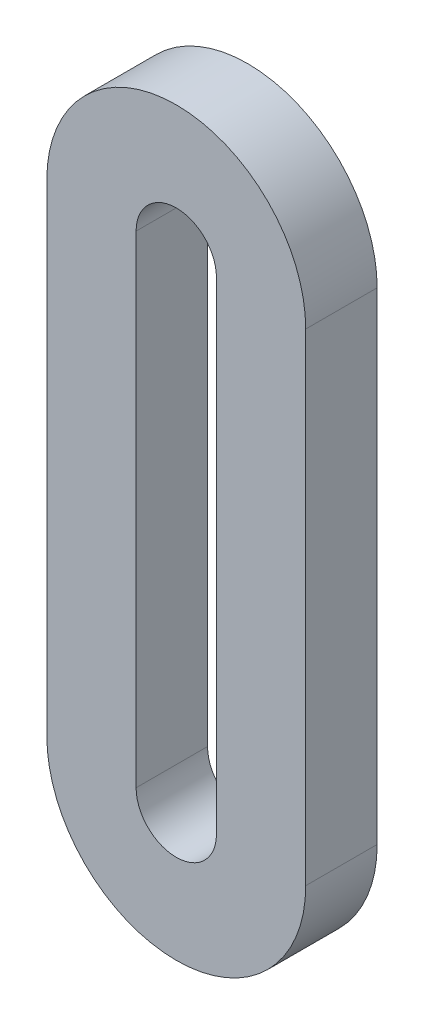
ISO-10303-21;
HEADER;
FILE_DESCRIPTION(('STEP AP214'),'2;1');
FILE_NAME('part.step','',(''),(''),'','','');
FILE_SCHEMA(('AUTOMOTIVE_DESIGN { 1 0 10303 214 1 1 1 1 }'));
ENDSEC;
DATA;
#1=APPLICATION_CONTEXT('core data for automotive mechanical design processes');
#2=APPLICATION_PROTOCOL_DEFINITION('international standard','automotive_design',2000,#1);
#3=PRODUCT_CONTEXT('',#1,'mechanical');
#4=PRODUCT('Part','Part','',(#3));
#5=PRODUCT_RELATED_PRODUCT_CATEGORY('part','',(#4));
#6=PRODUCT_DEFINITION_FORMATION('','',#4);
#7=PRODUCT_DEFINITION_CONTEXT('part definition',#1,'design');
#8=PRODUCT_DEFINITION('design','',#6,#7);
#9=PRODUCT_DEFINITION_SHAPE('','',#8);
#10=(LENGTH_UNIT() NAMED_UNIT(*) SI_UNIT(.MILLI.,.METRE.));
#11=(NAMED_UNIT(*) PLANE_ANGLE_UNIT() SI_UNIT($,.RADIAN.));
#12=(NAMED_UNIT(*) SI_UNIT($,.STERADIAN.) SOLID_ANGLE_UNIT());
#13=UNCERTAINTY_MEASURE_WITH_UNIT(LENGTH_MEASURE(1.E-05),#10,'distance_accuracy_value','');
#14=(GEOMETRIC_REPRESENTATION_CONTEXT(3) GLOBAL_UNCERTAINTY_ASSIGNED_CONTEXT((#13)) GLOBAL_UNIT_ASSIGNED_CONTEXT((#10,
#11,#12)) REPRESENTATION_CONTEXT('',''));
#15=CARTESIAN_POINT('',(0.,0.,0.));
#16=DIRECTION('',(0.,0.,1.));
#17=DIRECTION('',(1.,0.,0.));
#18=AXIS2_PLACEMENT_3D('',#15,#16,#17);
#19=CARTESIAN_POINT('',(0.,13.5,4.));
#20=DIRECTION('',(0.,0.,1.));
#21=DIRECTION('',(1.,0.,0.));
#22=AXIS2_PLACEMENT_3D('',#19,#20,#21);
#23=PLANE('',#22);
#24=CARTESIAN_POINT('',(0.,13.5,4.));
#25=DIRECTION('',(0.,0.,1.));
#26=DIRECTION('',(1.,0.,0.));
#27=AXIS2_PLACEMENT_3D('',#24,#25,#26);
#28=CIRCLE('',#27,7.25);
#29=CARTESIAN_POINT('',(7.25,13.5,4.));
#30=VERTEX_POINT('',#29);
#31=CARTESIAN_POINT('',(-7.25,13.5,4.));
#32=VERTEX_POINT('',#31);
#33=EDGE_CURVE('E153',#30,#32,#28,.T.);
#34=ORIENTED_EDGE('',*,*,#33,.T.);
#35=DIRECTION('',(0.,-1.,0.));
#36=VECTOR('',#35,1.);
#37=CARTESIAN_POINT('',(-7.25,13.5,4.));
#38=LINE('',#37,#36);
#39=CARTESIAN_POINT('',(-7.25,-13.5,4.));
#40=VERTEX_POINT('',#39);
#41=EDGE_CURVE('E157',#32,#40,#38,.T.);
#42=ORIENTED_EDGE('',*,*,#41,.T.);
#43=CARTESIAN_POINT('',(0.,-13.5,4.));
#44=DIRECTION('',(0.,0.,1.));
#45=DIRECTION('',(1.,0.,0.));
#46=AXIS2_PLACEMENT_3D('',#43,#44,#45);
#47=CIRCLE('',#46,7.25);
#48=CARTESIAN_POINT('',(7.25,-13.5,4.));
#49=VERTEX_POINT('',#48);
#50=EDGE_CURVE('E161',#40,#49,#47,.T.);
#51=ORIENTED_EDGE('',*,*,#50,.T.);
#52=DIRECTION('',(0.,1.,0.));
#53=VECTOR('',#52,1.);
#54=CARTESIAN_POINT('',(7.25,13.5,4.));
#55=LINE('',#54,#53);
#56=EDGE_CURVE('E164',#49,#30,#55,.T.);
#57=ORIENTED_EDGE('',*,*,#56,.T.);
#58=EDGE_LOOP('',(#34,#42,#51,#57));
#59=FACE_BOUND('',#58,.T.);
#60=DIRECTION('',(0.,-1.,0.));
#61=VECTOR('',#60,1.);
#62=CARTESIAN_POINT('',(-2.25,13.5,4.));
#63=LINE('',#62,#61);
#64=CARTESIAN_POINT('',(-2.25,13.5,4.));
#65=VERTEX_POINT('',#64);
#66=CARTESIAN_POINT('',(-2.25,-13.5,4.));
#67=VERTEX_POINT('',#66);
#68=EDGE_CURVE('E114',#65,#67,#63,.T.);
#69=ORIENTED_EDGE('',*,*,#68,.F.);
#70=CARTESIAN_POINT('',(0.,13.5,4.));
#71=DIRECTION('',(0.,0.,1.));
#72=DIRECTION('',(1.,0.,0.));
#73=AXIS2_PLACEMENT_3D('',#70,#71,#72);
#74=CIRCLE('',#73,2.25);
#75=CARTESIAN_POINT('',(2.25,13.5,4.));
#76=VERTEX_POINT('',#75);
#77=EDGE_CURVE('E105',#76,#65,#74,.T.);
#78=ORIENTED_EDGE('',*,*,#77,.F.);
#79=DIRECTION('',(0.,1.,0.));
#80=VECTOR('',#79,1.);
#81=CARTESIAN_POINT('',(2.25,13.5,4.));
#82=LINE('',#81,#80);
#83=CARTESIAN_POINT('',(2.25,-13.5,4.));
#84=VERTEX_POINT('',#83);
#85=EDGE_CURVE('E131',#84,#76,#82,.T.);
#86=ORIENTED_EDGE('',*,*,#85,.F.);
#87=CARTESIAN_POINT('',(0.,-13.5,4.));
#88=DIRECTION('',(0.,0.,1.));
#89=DIRECTION('',(1.,0.,0.));
#90=AXIS2_PLACEMENT_3D('',#87,#88,#89);
#91=CIRCLE('',#90,2.25);
#92=EDGE_CURVE('E127',#67,#84,#91,.T.);
#93=ORIENTED_EDGE('',*,*,#92,.F.);
#94=EDGE_LOOP('',(#69,#78,#86,#93));
#95=FACE_BOUND('',#94,.T.);
#96=ADVANCED_FACE('F39',(#59,#95),#23,.T.);
#97=CARTESIAN_POINT('',(0.,13.5,0.));
#98=DIRECTION('',(0.,0.,1.));
#99=DIRECTION('',(1.,0.,0.));
#100=AXIS2_PLACEMENT_3D('',#97,#98,#99);
#101=PLANE('',#100);
#102=CARTESIAN_POINT('',(0.,13.5,0.));
#103=DIRECTION('',(0.,0.,1.));
#104=DIRECTION('',(1.,0.,0.));
#105=AXIS2_PLACEMENT_3D('',#102,#103,#104);
#106=CIRCLE('',#105,7.25);
#107=CARTESIAN_POINT('',(7.25,13.5,0.));
#108=VERTEX_POINT('',#107);
#109=CARTESIAN_POINT('',(-7.25,13.5,0.));
#110=VERTEX_POINT('',#109);
#111=EDGE_CURVE('E123',#108,#110,#106,.T.);
#112=ORIENTED_EDGE('',*,*,#111,.F.);
#113=DIRECTION('',(0.,1.,0.));
#114=VECTOR('',#113,1.);
#115=CARTESIAN_POINT('',(7.25,13.5,0.));
#116=LINE('',#115,#114);
#117=CARTESIAN_POINT('',(7.25,-13.5,0.));
#118=VERTEX_POINT('',#117);
#119=EDGE_CURVE('E158',#118,#108,#116,.T.);
#120=ORIENTED_EDGE('',*,*,#119,.F.);
#121=CARTESIAN_POINT('',(0.,-13.5,0.));
#122=DIRECTION('',(0.,0.,1.));
#123=DIRECTION('',(1.,0.,0.));
#124=AXIS2_PLACEMENT_3D('',#121,#122,#123);
#125=CIRCLE('',#124,7.25);
#126=CARTESIAN_POINT('',(-7.25,-13.5,0.));
#127=VERTEX_POINT('',#126);
#128=EDGE_CURVE('E174',#127,#118,#125,.T.);
#129=ORIENTED_EDGE('',*,*,#128,.F.);
#130=DIRECTION('',(0.,-1.,0.));
#131=VECTOR('',#130,1.);
#132=CARTESIAN_POINT('',(-7.25,13.5,0.));
#133=LINE('',#132,#131);
#134=EDGE_CURVE('E171',#110,#127,#133,.T.);
#135=ORIENTED_EDGE('',*,*,#134,.F.);
#136=EDGE_LOOP('',(#112,#120,#129,#135));
#137=FACE_BOUND('',#136,.T.);
#138=CARTESIAN_POINT('',(0.,13.5,0.));
#139=DIRECTION('',(0.,0.,1.));
#140=DIRECTION('',(1.,0.,0.));
#141=AXIS2_PLACEMENT_3D('',#138,#139,#140);
#142=CIRCLE('',#141,2.25);
#143=CARTESIAN_POINT('',(2.25,13.5,0.));
#144=VERTEX_POINT('',#143);
#145=CARTESIAN_POINT('',(-2.25,13.5,0.));
#146=VERTEX_POINT('',#145);
#147=EDGE_CURVE('E63',#144,#146,#142,.T.);
#148=ORIENTED_EDGE('',*,*,#147,.T.);
#149=DIRECTION('',(0.,-1.,0.));
#150=VECTOR('',#149,1.);
#151=CARTESIAN_POINT('',(-2.25,13.5,0.));
#152=LINE('',#151,#150);
#153=CARTESIAN_POINT('',(-2.25,-13.5,0.));
#154=VERTEX_POINT('',#153);
#155=EDGE_CURVE('E121',#146,#154,#152,.T.);
#156=ORIENTED_EDGE('',*,*,#155,.T.);
#157=CARTESIAN_POINT('',(0.,-13.5,0.));
#158=DIRECTION('',(0.,0.,1.));
#159=DIRECTION('',(1.,0.,0.));
#160=AXIS2_PLACEMENT_3D('',#157,#158,#159);
#161=CIRCLE('',#160,2.25);
#162=CARTESIAN_POINT('',(2.25,-13.5,0.));
#163=VERTEX_POINT('',#162);
#164=EDGE_CURVE('E140',#154,#163,#161,.T.);
#165=ORIENTED_EDGE('',*,*,#164,.T.);
#166=DIRECTION('',(0.,1.,0.));
#167=VECTOR('',#166,1.);
#168=CARTESIAN_POINT('',(2.25,13.5,0.));
#169=LINE('',#168,#167);
#170=EDGE_CURVE('E115',#163,#144,#169,.T.);
#171=ORIENTED_EDGE('',*,*,#170,.T.);
#172=EDGE_LOOP('',(#148,#156,#165,#171));
#173=FACE_BOUND('',#172,.T.);
#174=ADVANCED_FACE('F197',(#137,#173),#101,.F.);
#175=CARTESIAN_POINT('',(0.,13.5,4.));
#176=DIRECTION('',(0.,0.,-1.));
#177=DIRECTION('',(-1.,0.,0.));
#178=AXIS2_PLACEMENT_3D('',#175,#176,#177);
#179=CYLINDRICAL_SURFACE('',#178,7.25);
#180=ORIENTED_EDGE('',*,*,#111,.T.);
#181=DIRECTION('',(0.,0.,-1.));
#182=VECTOR('',#181,1.);
#183=CARTESIAN_POINT('',(-7.25,13.5,4.));
#184=LINE('',#183,#182);
#185=EDGE_CURVE('E11',#32,#110,#184,.T.);
#186=ORIENTED_EDGE('',*,*,#185,.F.);
#187=ORIENTED_EDGE('',*,*,#33,.F.);
#188=DIRECTION('',(0.,0.,-1.));
#189=VECTOR('',#188,1.);
#190=CARTESIAN_POINT('',(7.25,13.5,4.));
#191=LINE('',#190,#189);
#192=EDGE_CURVE('E167',#30,#108,#191,.T.);
#193=ORIENTED_EDGE('',*,*,#192,.T.);
#194=EDGE_LOOP('',(#180,#186,#187,#193));
#195=FACE_BOUND('',#194,.T.);
#196=ADVANCED_FACE('F41',(#195),#179,.T.);
#197=CARTESIAN_POINT('',(-7.25,13.5,4.));
#198=DIRECTION('',(1.,0.,0.));
#199=DIRECTION('',(0.,0.,-1.));
#200=AXIS2_PLACEMENT_3D('',#197,#198,#199);
#201=PLANE('',#200);
#202=ORIENTED_EDGE('',*,*,#134,.T.);
#203=DIRECTION('',(0.,0.,-1.));
#204=VECTOR('',#203,1.);
#205=CARTESIAN_POINT('',(-7.25,-13.5,4.));
#206=LINE('',#205,#204);
#207=EDGE_CURVE('E48',#40,#127,#206,.T.);
#208=ORIENTED_EDGE('',*,*,#207,.F.);
#209=ORIENTED_EDGE('',*,*,#41,.F.);
#210=ORIENTED_EDGE('',*,*,#185,.T.);
#211=EDGE_LOOP('',(#202,#208,#209,#210));
#212=FACE_BOUND('',#211,.T.);
#213=ADVANCED_FACE('F207',(#212),#201,.F.);
#214=CARTESIAN_POINT('',(0.,-13.5,4.));
#215=DIRECTION('',(0.,0.,-1.));
#216=DIRECTION('',(-1.,0.,0.));
#217=AXIS2_PLACEMENT_3D('',#214,#215,#216);
#218=CYLINDRICAL_SURFACE('',#217,7.25);
#219=ORIENTED_EDGE('',*,*,#128,.T.);
#220=DIRECTION('',(0.,0.,-1.));
#221=VECTOR('',#220,1.);
#222=CARTESIAN_POINT('',(7.25,-13.5,4.));
#223=LINE('',#222,#221);
#224=EDGE_CURVE('E182',#49,#118,#223,.T.);
#225=ORIENTED_EDGE('',*,*,#224,.F.);
#226=ORIENTED_EDGE('',*,*,#50,.F.);
#227=ORIENTED_EDGE('',*,*,#207,.T.);
#228=EDGE_LOOP('',(#219,#225,#226,#227));
#229=FACE_BOUND('',#228,.T.);
#230=ADVANCED_FACE('F191',(#229),#218,.T.);
#231=CARTESIAN_POINT('',(7.25,13.5,4.));
#232=DIRECTION('',(-1.,0.,0.));
#233=DIRECTION('',(0.,0.,1.));
#234=AXIS2_PLACEMENT_3D('',#231,#232,#233);
#235=PLANE('',#234);
#236=ORIENTED_EDGE('',*,*,#119,.T.);
#237=ORIENTED_EDGE('',*,*,#192,.F.);
#238=ORIENTED_EDGE('',*,*,#56,.F.);
#239=ORIENTED_EDGE('',*,*,#224,.T.);
#240=EDGE_LOOP('',(#236,#237,#238,#239));
#241=FACE_BOUND('',#240,.T.);
#242=ADVANCED_FACE('F201',(#241),#235,.F.);
#243=CARTESIAN_POINT('',(0.,13.5,4.));
#244=DIRECTION('',(0.,0.,-1.));
#245=DIRECTION('',(-1.,0.,0.));
#246=AXIS2_PLACEMENT_3D('',#243,#244,#245);
#247=CYLINDRICAL_SURFACE('',#246,2.25);
#248=ORIENTED_EDGE('',*,*,#147,.F.);
#249=DIRECTION('',(0.,0.,-1.));
#250=VECTOR('',#249,1.);
#251=CARTESIAN_POINT('',(2.25,13.5,4.));
#252=LINE('',#251,#250);
#253=EDGE_CURVE('E109',#76,#144,#252,.T.);
#254=ORIENTED_EDGE('',*,*,#253,.F.);
#255=ORIENTED_EDGE('',*,*,#77,.T.);
#256=DIRECTION('',(0.,0.,-1.));
#257=VECTOR('',#256,1.);
#258=CARTESIAN_POINT('',(-2.25,13.5,4.));
#259=LINE('',#258,#257);
#260=EDGE_CURVE('E108',#65,#146,#259,.T.);
#261=ORIENTED_EDGE('',*,*,#260,.T.);
#262=EDGE_LOOP('',(#248,#254,#255,#261));
#263=FACE_BOUND('',#262,.T.);
#264=ADVANCED_FACE('F107',(#263),#247,.F.);
#265=CARTESIAN_POINT('',(-2.25,13.5,4.));
#266=DIRECTION('',(1.,0.,0.));
#267=DIRECTION('',(0.,0.,-1.));
#268=AXIS2_PLACEMENT_3D('',#265,#266,#267);
#269=PLANE('',#268);
#270=ORIENTED_EDGE('',*,*,#155,.F.);
#271=ORIENTED_EDGE('',*,*,#260,.F.);
#272=ORIENTED_EDGE('',*,*,#68,.T.);
#273=DIRECTION('',(0.,0.,-1.));
#274=VECTOR('',#273,1.);
#275=CARTESIAN_POINT('',(-2.25,-13.5,4.));
#276=LINE('',#275,#274);
#277=EDGE_CURVE('E124',#67,#154,#276,.T.);
#278=ORIENTED_EDGE('',*,*,#277,.T.);
#279=EDGE_LOOP('',(#270,#271,#272,#278));
#280=FACE_BOUND('',#279,.T.);
#281=ADVANCED_FACE('F118',(#280),#269,.T.);
#282=CARTESIAN_POINT('',(0.,-13.5,4.));
#283=DIRECTION('',(0.,0.,-1.));
#284=DIRECTION('',(-1.,0.,0.));
#285=AXIS2_PLACEMENT_3D('',#282,#283,#284);
#286=CYLINDRICAL_SURFACE('',#285,2.25);
#287=ORIENTED_EDGE('',*,*,#164,.F.);
#288=ORIENTED_EDGE('',*,*,#277,.F.);
#289=ORIENTED_EDGE('',*,*,#92,.T.);
#290=DIRECTION('',(0.,0.,-1.));
#291=VECTOR('',#290,1.);
#292=CARTESIAN_POINT('',(2.25,-13.5,4.));
#293=LINE('',#292,#291);
#294=EDGE_CURVE('E55',#84,#163,#293,.T.);
#295=ORIENTED_EDGE('',*,*,#294,.T.);
#296=EDGE_LOOP('',(#287,#288,#289,#295));
#297=FACE_BOUND('',#296,.T.);
#298=ADVANCED_FACE('F230',(#297),#286,.F.);
#299=CARTESIAN_POINT('',(2.25,13.5,4.));
#300=DIRECTION('',(-1.,0.,0.));
#301=DIRECTION('',(0.,0.,1.));
#302=AXIS2_PLACEMENT_3D('',#299,#300,#301);
#303=PLANE('',#302);
#304=ORIENTED_EDGE('',*,*,#170,.F.);
#305=ORIENTED_EDGE('',*,*,#294,.F.);
#306=ORIENTED_EDGE('',*,*,#85,.T.);
#307=ORIENTED_EDGE('',*,*,#253,.T.);
#308=EDGE_LOOP('',(#304,#305,#306,#307));
#309=FACE_BOUND('',#308,.T.);
#310=ADVANCED_FACE('F234',(#309),#303,.T.);
#311=CLOSED_SHELL('',(#96,#174,#196,#213,#230,#242,#264,#281,#298,#310));
#312=MANIFOLD_SOLID_BREP('B2',#311);
#313=ADVANCED_BREP_SHAPE_REPRESENTATION('',(#18,#312),#14);
#314=SHAPE_DEFINITION_REPRESENTATION(#9,#313);
ENDSEC;
END-ISO-10303-21;
